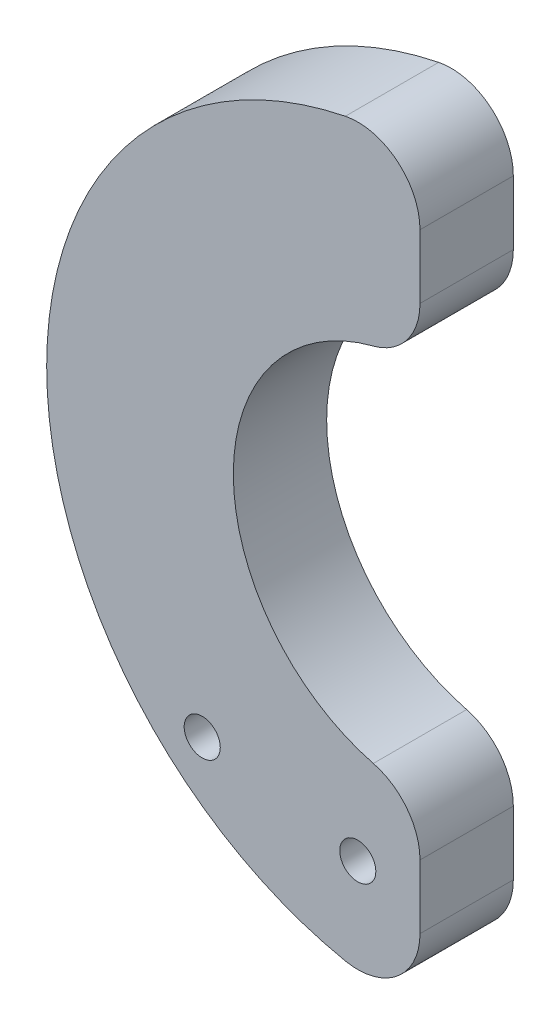
ISO-10303-21;
HEADER;
FILE_DESCRIPTION(('STEP AP214'),'2;1');
FILE_NAME('part.step','',(''),(''),'','','');
FILE_SCHEMA(('AUTOMOTIVE_DESIGN { 1 0 10303 214 1 1 1 1 }'));
ENDSEC;
DATA;
#1=APPLICATION_CONTEXT('core data for automotive mechanical design processes');
#2=APPLICATION_PROTOCOL_DEFINITION('international standard','automotive_design',2000,#1);
#3=PRODUCT_CONTEXT('',#1,'mechanical');
#4=PRODUCT('Part','Part','',(#3));
#5=PRODUCT_RELATED_PRODUCT_CATEGORY('part','',(#4));
#6=PRODUCT_DEFINITION_FORMATION('','',#4);
#7=PRODUCT_DEFINITION_CONTEXT('part definition',#1,'design');
#8=PRODUCT_DEFINITION('design','',#6,#7);
#9=PRODUCT_DEFINITION_SHAPE('','',#8);
#10=(LENGTH_UNIT() NAMED_UNIT(*) SI_UNIT(.MILLI.,.METRE.));
#11=(NAMED_UNIT(*) PLANE_ANGLE_UNIT() SI_UNIT($,.RADIAN.));
#12=(NAMED_UNIT(*) SI_UNIT($,.STERADIAN.) SOLID_ANGLE_UNIT());
#13=UNCERTAINTY_MEASURE_WITH_UNIT(LENGTH_MEASURE(1.E-05),#10,'distance_accuracy_value','');
#14=(GEOMETRIC_REPRESENTATION_CONTEXT(3) GLOBAL_UNCERTAINTY_ASSIGNED_CONTEXT((#13)) GLOBAL_UNIT_ASSIGNED_CONTEXT((#10,
#11,#12)) REPRESENTATION_CONTEXT('',''));
#15=CARTESIAN_POINT('',(0.,0.,0.));
#16=DIRECTION('',(0.,0.,1.));
#17=DIRECTION('',(1.,0.,0.));
#18=AXIS2_PLACEMENT_3D('',#15,#16,#17);
#19=CARTESIAN_POINT('',(-3.175,12.2967221242086,4.7625));
#20=DIRECTION('',(0.,0.,-1.));
#21=DIRECTION('',(-1.,0.,0.));
#22=AXIS2_PLACEMENT_3D('',#19,#20,#21);
#23=CYLINDRICAL_SURFACE('',#22,3.175);
#24=CARTESIAN_POINT('',(-3.175,12.2967221242086,0.));
#25=DIRECTION('',(0.,0.,-1.));
#26=DIRECTION('',(-1.,0.,0.));
#27=AXIS2_PLACEMENT_3D('',#24,#25,#26);
#28=CIRCLE('',#27,3.175);
#29=CARTESIAN_POINT('',(0.,12.2967221242086,0.));
#30=VERTEX_POINT('',#29);
#31=CARTESIAN_POINT('',(-2.38125,9.22254159315641,0.));
#32=VERTEX_POINT('',#31);
#33=EDGE_CURVE('E132',#30,#32,#28,.T.);
#34=ORIENTED_EDGE('',*,*,#33,.F.);
#35=DIRECTION('',(0.,0.,-1.));
#36=VECTOR('',#35,1.);
#37=CARTESIAN_POINT('',(0.,12.2967221242086,4.7625));
#38=LINE('',#37,#36);
#39=CARTESIAN_POINT('',(0.,12.2967221242086,4.7625));
#40=VERTEX_POINT('',#39);
#41=EDGE_CURVE('E11',#40,#30,#38,.T.);
#42=ORIENTED_EDGE('',*,*,#41,.F.);
#43=CARTESIAN_POINT('',(-3.175,12.2967221242086,4.7625));
#44=DIRECTION('',(0.,0.,-1.));
#45=DIRECTION('',(-1.,0.,0.));
#46=AXIS2_PLACEMENT_3D('',#43,#44,#45);
#47=CIRCLE('',#46,3.175);
#48=CARTESIAN_POINT('',(-2.38125,9.22254159315641,4.7625));
#49=VERTEX_POINT('',#48);
#50=EDGE_CURVE('E153',#40,#49,#47,.T.);
#51=ORIENTED_EDGE('',*,*,#50,.T.);
#52=DIRECTION('',(0.,0.,-1.));
#53=VECTOR('',#52,1.);
#54=CARTESIAN_POINT('',(-2.38125,9.22254159315641,4.7625));
#55=LINE('',#54,#53);
#56=EDGE_CURVE('E38',#49,#32,#55,.T.);
#57=ORIENTED_EDGE('',*,*,#56,.T.);
#58=EDGE_LOOP('',(#34,#42,#51,#57));
#59=FACE_BOUND('',#58,.T.);
#60=ADVANCED_FACE('F35',(#59),#23,.T.);
#61=CARTESIAN_POINT('',(0.,15.5542598666732,4.7625));
#62=DIRECTION('',(1.,0.,0.));
#63=DIRECTION('',(0.,1.,0.));
#64=AXIS2_PLACEMENT_3D('',#61,#62,#63);
#65=PLANE('',#64);
#66=DIRECTION('',(0.,-1.,0.));
#67=VECTOR('',#66,1.);
#68=CARTESIAN_POINT('',(0.,15.5542598666732,0.));
#69=LINE('',#68,#67);
#70=CARTESIAN_POINT('',(0.,15.5542598666732,0.));
#71=VERTEX_POINT('',#70);
#72=EDGE_CURVE('E151',#71,#30,#69,.T.);
#73=ORIENTED_EDGE('',*,*,#72,.F.);
#74=DIRECTION('',(0.,0.,-1.));
#75=VECTOR('',#74,1.);
#76=CARTESIAN_POINT('',(0.,15.5542598666732,4.7625));
#77=LINE('',#76,#75);
#78=CARTESIAN_POINT('',(0.,15.5542598666732,4.7625));
#79=VERTEX_POINT('',#78);
#80=EDGE_CURVE('E44',#79,#71,#77,.T.);
#81=ORIENTED_EDGE('',*,*,#80,.F.);
#82=DIRECTION('',(0.,-1.,0.));
#83=VECTOR('',#82,1.);
#84=CARTESIAN_POINT('',(0.,15.5542598666732,4.7625));
#85=LINE('',#84,#83);
#86=EDGE_CURVE('E114',#79,#40,#85,.T.);
#87=ORIENTED_EDGE('',*,*,#86,.T.);
#88=ORIENTED_EDGE('',*,*,#41,.T.);
#89=EDGE_LOOP('',(#73,#81,#87,#88));
#90=FACE_BOUND('',#89,.T.);
#91=ADVANCED_FACE('F166',(#90),#65,.T.);
#92=CARTESIAN_POINT('',(-3.175,15.5542598666732,4.7625));
#93=DIRECTION('',(0.,0.,-1.));
#94=DIRECTION('',(-1.,0.,0.));
#95=AXIS2_PLACEMENT_3D('',#92,#93,#94);
#96=CYLINDRICAL_SURFACE('',#95,3.175);
#97=CARTESIAN_POINT('',(-3.175,15.5542598666732,0.));
#98=DIRECTION('',(0.,0.,1.));
#99=DIRECTION('',(1.,0.,0.));
#100=AXIS2_PLACEMENT_3D('',#97,#98,#99);
#101=CIRCLE('',#100,3.175);
#102=CARTESIAN_POINT('',(-3.81,18.6651118400078,0.));
#103=VERTEX_POINT('',#102);
#104=EDGE_CURVE('E118',#71,#103,#101,.T.);
#105=ORIENTED_EDGE('',*,*,#104,.T.);
#106=DIRECTION('',(0.,0.,-1.));
#107=VECTOR('',#106,1.);
#108=CARTESIAN_POINT('',(-3.81,18.6651118400078,4.7625));
#109=LINE('',#108,#107);
#110=CARTESIAN_POINT('',(-3.81,18.6651118400078,4.7625));
#111=VERTEX_POINT('',#110);
#112=EDGE_CURVE('E116',#111,#103,#109,.T.);
#113=ORIENTED_EDGE('',*,*,#112,.F.);
#114=CARTESIAN_POINT('',(-3.175,15.5542598666732,4.7625));
#115=DIRECTION('',(0.,0.,1.));
#116=DIRECTION('',(1.,0.,0.));
#117=AXIS2_PLACEMENT_3D('',#114,#115,#116);
#118=CIRCLE('',#117,3.175);
#119=EDGE_CURVE('E107',#79,#111,#118,.T.);
#120=ORIENTED_EDGE('',*,*,#119,.F.);
#121=ORIENTED_EDGE('',*,*,#80,.T.);
#122=EDGE_LOOP('',(#105,#113,#120,#121));
#123=FACE_BOUND('',#122,.T.);
#124=ADVANCED_FACE('F117',(#123),#96,.T.);
#125=CARTESIAN_POINT('',(0.,0.,4.7625));
#126=DIRECTION('',(0.,0.,-1.));
#127=DIRECTION('',(-1.,0.,0.));
#128=AXIS2_PLACEMENT_3D('',#125,#126,#127);
#129=CYLINDRICAL_SURFACE('',#128,19.05);
#130=CARTESIAN_POINT('',(0.,0.,0.));
#131=DIRECTION('',(0.,0.,-1.));
#132=DIRECTION('',(-1.,0.,0.));
#133=AXIS2_PLACEMENT_3D('',#130,#131,#132);
#134=CIRCLE('',#133,19.05);
#135=CARTESIAN_POINT('',(-3.81,-18.6651118400078,0.));
#136=VERTEX_POINT('',#135);
#137=EDGE_CURVE('E148',#136,#103,#134,.T.);
#138=ORIENTED_EDGE('',*,*,#137,.F.);
#139=DIRECTION('',(0.,0.,-1.));
#140=VECTOR('',#139,1.);
#141=CARTESIAN_POINT('',(-3.81,-18.6651118400078,4.7625));
#142=LINE('',#141,#140);
#143=CARTESIAN_POINT('',(-3.81,-18.6651118400078,4.7625));
#144=VERTEX_POINT('',#143);
#145=EDGE_CURVE('E122',#144,#136,#142,.T.);
#146=ORIENTED_EDGE('',*,*,#145,.F.);
#147=CARTESIAN_POINT('',(0.,0.,4.7625));
#148=DIRECTION('',(0.,0.,-1.));
#149=DIRECTION('',(-1.,0.,0.));
#150=AXIS2_PLACEMENT_3D('',#147,#148,#149);
#151=CIRCLE('',#150,19.05);
#152=EDGE_CURVE('E112',#144,#111,#151,.T.);
#153=ORIENTED_EDGE('',*,*,#152,.T.);
#154=ORIENTED_EDGE('',*,*,#112,.T.);
#155=EDGE_LOOP('',(#138,#146,#153,#154));
#156=FACE_BOUND('',#155,.T.);
#157=ADVANCED_FACE('F124',(#156),#129,.T.);
#158=CARTESIAN_POINT('',(-3.175,-15.5542598666732,4.7625));
#159=DIRECTION('',(0.,0.,-1.));
#160=DIRECTION('',(-1.,0.,0.));
#161=AXIS2_PLACEMENT_3D('',#158,#159,#160);
#162=CYLINDRICAL_SURFACE('',#161,3.175);
#163=CARTESIAN_POINT('',(-3.175,-15.5542598666732,0.));
#164=DIRECTION('',(0.,0.,-1.));
#165=DIRECTION('',(-1.,0.,0.));
#166=AXIS2_PLACEMENT_3D('',#163,#164,#165);
#167=CIRCLE('',#166,3.175);
#168=CARTESIAN_POINT('',(0.,-15.5542598666732,0.));
#169=VERTEX_POINT('',#168);
#170=EDGE_CURVE('E145',#169,#136,#167,.T.);
#171=ORIENTED_EDGE('',*,*,#170,.F.);
#172=DIRECTION('',(0.,0.,-1.));
#173=VECTOR('',#172,1.);
#174=CARTESIAN_POINT('',(0.,-15.5542598666732,4.7625));
#175=LINE('',#174,#173);
#176=CARTESIAN_POINT('',(0.,-15.5542598666732,4.7625));
#177=VERTEX_POINT('',#176);
#178=EDGE_CURVE('E157',#177,#169,#175,.T.);
#179=ORIENTED_EDGE('',*,*,#178,.F.);
#180=CARTESIAN_POINT('',(-3.175,-15.5542598666732,4.7625));
#181=DIRECTION('',(0.,0.,-1.));
#182=DIRECTION('',(-1.,0.,0.));
#183=AXIS2_PLACEMENT_3D('',#180,#181,#182);
#184=CIRCLE('',#183,3.175);
#185=EDGE_CURVE('E125',#177,#144,#184,.T.);
#186=ORIENTED_EDGE('',*,*,#185,.T.);
#187=ORIENTED_EDGE('',*,*,#145,.T.);
#188=EDGE_LOOP('',(#171,#179,#186,#187));
#189=FACE_BOUND('',#188,.T.);
#190=ADVANCED_FACE('F179',(#189),#162,.T.);
#191=CARTESIAN_POINT('',(0.,-12.2967221242085,4.7625));
#192=DIRECTION('',(1.,0.,0.));
#193=DIRECTION('',(0.,1.,0.));
#194=AXIS2_PLACEMENT_3D('',#191,#192,#193);
#195=PLANE('',#194);
#196=DIRECTION('',(0.,-1.,0.));
#197=VECTOR('',#196,1.);
#198=CARTESIAN_POINT('',(0.,-12.2967221242085,0.));
#199=LINE('',#198,#197);
#200=CARTESIAN_POINT('',(0.,-12.2967221242085,0.));
#201=VERTEX_POINT('',#200);
#202=EDGE_CURVE('E142',#201,#169,#199,.T.);
#203=ORIENTED_EDGE('',*,*,#202,.F.);
#204=DIRECTION('',(0.,0.,-1.));
#205=VECTOR('',#204,1.);
#206=CARTESIAN_POINT('',(0.,-12.2967221242085,4.7625));
#207=LINE('',#206,#205);
#208=CARTESIAN_POINT('',(0.,-12.2967221242085,4.7625));
#209=VERTEX_POINT('',#208);
#210=EDGE_CURVE('E159',#209,#201,#207,.T.);
#211=ORIENTED_EDGE('',*,*,#210,.F.);
#212=DIRECTION('',(0.,-1.,0.));
#213=VECTOR('',#212,1.);
#214=CARTESIAN_POINT('',(0.,-12.2967221242085,4.7625));
#215=LINE('',#214,#213);
#216=EDGE_CURVE('E127',#209,#177,#215,.T.);
#217=ORIENTED_EDGE('',*,*,#216,.T.);
#218=ORIENTED_EDGE('',*,*,#178,.T.);
#219=EDGE_LOOP('',(#203,#211,#217,#218));
#220=FACE_BOUND('',#219,.T.);
#221=ADVANCED_FACE('F182',(#220),#195,.T.);
#222=CARTESIAN_POINT('',(-3.175,-12.2967221242085,4.7625));
#223=DIRECTION('',(0.,0.,-1.));
#224=DIRECTION('',(-1.,0.,0.));
#225=AXIS2_PLACEMENT_3D('',#222,#223,#224);
#226=CYLINDRICAL_SURFACE('',#225,3.175);
#227=CARTESIAN_POINT('',(-3.175,-12.2967221242085,0.));
#228=DIRECTION('',(0.,0.,1.));
#229=DIRECTION('',(1.,0.,0.));
#230=AXIS2_PLACEMENT_3D('',#227,#228,#229);
#231=CIRCLE('',#230,3.175);
#232=CARTESIAN_POINT('',(-2.38125,-9.22254159315641,0.));
#233=VERTEX_POINT('',#232);
#234=EDGE_CURVE('E139',#201,#233,#231,.T.);
#235=ORIENTED_EDGE('',*,*,#234,.T.);
#236=DIRECTION('',(0.,0.,-1.));
#237=VECTOR('',#236,1.);
#238=CARTESIAN_POINT('',(-2.38125,-9.22254159315641,4.7625));
#239=LINE('',#238,#237);
#240=CARTESIAN_POINT('',(-2.38125,-9.22254159315641,4.7625));
#241=VERTEX_POINT('',#240);
#242=EDGE_CURVE('E160',#241,#233,#239,.T.);
#243=ORIENTED_EDGE('',*,*,#242,.F.);
#244=CARTESIAN_POINT('',(-3.175,-12.2967221242085,4.7625));
#245=DIRECTION('',(0.,0.,1.));
#246=DIRECTION('',(1.,0.,0.));
#247=AXIS2_PLACEMENT_3D('',#244,#245,#246);
#248=CIRCLE('',#247,3.175);
#249=EDGE_CURVE('E228',#209,#241,#248,.T.);
#250=ORIENTED_EDGE('',*,*,#249,.F.);
#251=ORIENTED_EDGE('',*,*,#210,.T.);
#252=EDGE_LOOP('',(#235,#243,#250,#251));
#253=FACE_BOUND('',#252,.T.);
#254=ADVANCED_FACE('F186',(#253),#226,.T.);
#255=CARTESIAN_POINT('',(0.,0.,4.7625));
#256=DIRECTION('',(0.,0.,-1.));
#257=DIRECTION('',(-1.,0.,0.));
#258=AXIS2_PLACEMENT_3D('',#255,#256,#257);
#259=CYLINDRICAL_SURFACE('',#258,9.525);
#260=CARTESIAN_POINT('',(0.,0.,0.));
#261=DIRECTION('',(0.,0.,1.));
#262=DIRECTION('',(1.,0.,0.));
#263=AXIS2_PLACEMENT_3D('',#260,#261,#262);
#264=CIRCLE('',#263,9.525);
#265=EDGE_CURVE('E135',#32,#233,#264,.T.);
#266=ORIENTED_EDGE('',*,*,#265,.F.);
#267=ORIENTED_EDGE('',*,*,#56,.F.);
#268=CARTESIAN_POINT('',(0.,0.,4.7625));
#269=DIRECTION('',(0.,0.,1.));
#270=DIRECTION('',(1.,0.,0.));
#271=AXIS2_PLACEMENT_3D('',#268,#269,#270);
#272=CIRCLE('',#271,9.525);
#273=EDGE_CURVE('E226',#49,#241,#272,.T.);
#274=ORIENTED_EDGE('',*,*,#273,.T.);
#275=ORIENTED_EDGE('',*,*,#242,.T.);
#276=EDGE_LOOP('',(#266,#267,#274,#275));
#277=FACE_BOUND('',#276,.T.);
#278=ADVANCED_FACE('F162',(#277),#259,.F.);
#279=CARTESIAN_POINT('',(-3.175,12.2967221242086,4.7625));
#280=DIRECTION('',(0.,0.,-1.));
#281=DIRECTION('',(-1.,0.,0.));
#282=AXIS2_PLACEMENT_3D('',#279,#280,#281);
#283=PLANE('',#282);
#284=CARTESIAN_POINT('',(-3.175,-13.930255964985,4.7625));
#285=DIRECTION('',(0.,0.,1.));
#286=DIRECTION('',(1.,0.,0.));
#287=AXIS2_PLACEMENT_3D('',#284,#285,#286);
#288=CIRCLE('',#287,0.92075);
#289=CARTESIAN_POINT('',(-2.25425,-13.930255964985,4.7625));
#290=VERTEX_POINT('',#289);
#291=EDGE_CURVE('E215',#290,#290,#288,.T.);
#292=ORIENTED_EDGE('',*,*,#291,.F.);
#293=EDGE_LOOP('',(#292));
#294=FACE_BOUND('',#293,.T.);
#295=CARTESIAN_POINT('',(-11.1125,-12.4241526999832,4.7625));
#296=DIRECTION('',(0.,0.,1.));
#297=DIRECTION('',(1.,0.,0.));
#298=AXIS2_PLACEMENT_3D('',#295,#296,#297);
#299=CIRCLE('',#298,0.92075);
#300=CARTESIAN_POINT('',(-10.19175,-12.4241526999832,4.7625));
#301=VERTEX_POINT('',#300);
#302=EDGE_CURVE('E216',#301,#301,#299,.T.);
#303=ORIENTED_EDGE('',*,*,#302,.F.);
#304=EDGE_LOOP('',(#303));
#305=FACE_BOUND('',#304,.T.);
#306=ORIENTED_EDGE('',*,*,#50,.F.);
#307=ORIENTED_EDGE('',*,*,#86,.F.);
#308=ORIENTED_EDGE('',*,*,#119,.T.);
#309=ORIENTED_EDGE('',*,*,#152,.F.);
#310=ORIENTED_EDGE('',*,*,#185,.F.);
#311=ORIENTED_EDGE('',*,*,#216,.F.);
#312=ORIENTED_EDGE('',*,*,#249,.T.);
#313=ORIENTED_EDGE('',*,*,#273,.F.);
#314=EDGE_LOOP('',(#306,#307,#308,#309,#310,#311,#312,#313));
#315=FACE_BOUND('',#314,.T.);
#316=ADVANCED_FACE('F109',(#294,#305,#315),#283,.F.);
#317=CARTESIAN_POINT('',(-3.175,12.2967221242086,0.));
#318=DIRECTION('',(0.,0.,-1.));
#319=DIRECTION('',(-1.,0.,0.));
#320=AXIS2_PLACEMENT_3D('',#317,#318,#319);
#321=PLANE('',#320);
#322=CARTESIAN_POINT('',(-3.175,-13.930255964985,0.));
#323=DIRECTION('',(0.,0.,1.));
#324=DIRECTION('',(1.,0.,0.));
#325=AXIS2_PLACEMENT_3D('',#322,#323,#324);
#326=CIRCLE('',#325,0.92075);
#327=CARTESIAN_POINT('',(-2.25425,-13.930255964985,0.));
#328=VERTEX_POINT('',#327);
#329=EDGE_CURVE('E136',#328,#328,#326,.T.);
#330=ORIENTED_EDGE('',*,*,#329,.T.);
#331=EDGE_LOOP('',(#330));
#332=FACE_BOUND('',#331,.T.);
#333=CARTESIAN_POINT('',(-11.1125,-12.4241526999832,0.));
#334=DIRECTION('',(0.,0.,1.));
#335=DIRECTION('',(1.,0.,0.));
#336=AXIS2_PLACEMENT_3D('',#333,#334,#335);
#337=CIRCLE('',#336,0.92075);
#338=CARTESIAN_POINT('',(-10.19175,-12.4241526999832,0.));
#339=VERTEX_POINT('',#338);
#340=EDGE_CURVE('E220',#339,#339,#337,.T.);
#341=ORIENTED_EDGE('',*,*,#340,.T.);
#342=EDGE_LOOP('',(#341));
#343=FACE_BOUND('',#342,.T.);
#344=ORIENTED_EDGE('',*,*,#33,.T.);
#345=ORIENTED_EDGE('',*,*,#265,.T.);
#346=ORIENTED_EDGE('',*,*,#234,.F.);
#347=ORIENTED_EDGE('',*,*,#202,.T.);
#348=ORIENTED_EDGE('',*,*,#170,.T.);
#349=ORIENTED_EDGE('',*,*,#137,.T.);
#350=ORIENTED_EDGE('',*,*,#104,.F.);
#351=ORIENTED_EDGE('',*,*,#72,.T.);
#352=EDGE_LOOP('',(#344,#345,#346,#347,#348,#349,#350,#351));
#353=FACE_BOUND('',#352,.T.);
#354=ADVANCED_FACE('F165',(#332,#343,#353),#321,.T.);
#355=CARTESIAN_POINT('',(-11.1125,-12.4241526999832,0.));
#356=DIRECTION('',(0.,0.,1.));
#357=DIRECTION('',(1.,0.,0.));
#358=AXIS2_PLACEMENT_3D('',#355,#356,#357);
#359=CYLINDRICAL_SURFACE('',#358,0.92075);
#360=CARTESIAN_POINT('',(-10.19175,-12.4241526999832,0.));
#361=CARTESIAN_POINT('',(-10.19175,-12.4241526999832,0.049609375));
#362=CARTESIAN_POINT('',(-10.19175,-12.4241526999832,0.09921875));
#363=CARTESIAN_POINT('',(-10.19175,-12.4241526999832,0.1984375));
#364=CARTESIAN_POINT('',(-10.19175,-12.4241526999832,0.248046875));
#365=CARTESIAN_POINT('',(-10.19175,-12.4241526999832,0.347265625));
#366=CARTESIAN_POINT('',(-10.19175,-12.4241526999832,0.396875));
#367=CARTESIAN_POINT('',(-10.19175,-12.4241526999832,0.49609375));
#368=CARTESIAN_POINT('',(-10.19175,-12.4241526999832,0.545703125));
#369=CARTESIAN_POINT('',(-10.19175,-12.4241526999832,0.644921875));
#370=CARTESIAN_POINT('',(-10.19175,-12.4241526999832,0.69453125));
#371=CARTESIAN_POINT('',(-10.19175,-12.4241526999832,0.79375));
#372=CARTESIAN_POINT('',(-10.19175,-12.4241526999832,0.843359375));
#373=CARTESIAN_POINT('',(-10.19175,-12.4241526999832,0.942578125));
#374=CARTESIAN_POINT('',(-10.19175,-12.4241526999832,0.9921875));
#375=CARTESIAN_POINT('',(-10.19175,-12.4241526999832,1.09140625));
#376=CARTESIAN_POINT('',(-10.19175,-12.4241526999832,1.141015625));
#377=CARTESIAN_POINT('',(-10.19175,-12.4241526999832,1.240234375));
#378=CARTESIAN_POINT('',(-10.19175,-12.4241526999832,1.28984375));
#379=CARTESIAN_POINT('',(-10.19175,-12.4241526999832,1.3890625));
#380=CARTESIAN_POINT('',(-10.19175,-12.4241526999832,1.438671875));
#381=CARTESIAN_POINT('',(-10.19175,-12.4241526999832,1.537890625));
#382=CARTESIAN_POINT('',(-10.19175,-12.4241526999832,1.5875));
#383=CARTESIAN_POINT('',(-10.19175,-12.4241526999832,1.68671875));
#384=CARTESIAN_POINT('',(-10.19175,-12.4241526999832,1.736328125));
#385=CARTESIAN_POINT('',(-10.19175,-12.4241526999832,1.835546875));
#386=CARTESIAN_POINT('',(-10.19175,-12.4241526999832,1.88515625));
#387=CARTESIAN_POINT('',(-10.19175,-12.4241526999832,1.984375));
#388=CARTESIAN_POINT('',(-10.19175,-12.4241526999832,2.033984375));
#389=CARTESIAN_POINT('',(-10.19175,-12.4241526999832,2.133203125));
#390=CARTESIAN_POINT('',(-10.19175,-12.4241526999832,2.1828125));
#391=CARTESIAN_POINT('',(-10.19175,-12.4241526999832,2.28203125));
#392=CARTESIAN_POINT('',(-10.19175,-12.4241526999832,2.331640625));
#393=CARTESIAN_POINT('',(-10.19175,-12.4241526999832,2.430859375));
#394=CARTESIAN_POINT('',(-10.19175,-12.4241526999832,2.48046875));
#395=CARTESIAN_POINT('',(-10.19175,-12.4241526999832,2.5796875));
#396=CARTESIAN_POINT('',(-10.19175,-12.4241526999832,2.629296875));
#397=CARTESIAN_POINT('',(-10.19175,-12.4241526999832,2.728515625));
#398=CARTESIAN_POINT('',(-10.19175,-12.4241526999832,2.778125));
#399=CARTESIAN_POINT('',(-10.19175,-12.4241526999832,2.87734375));
#400=CARTESIAN_POINT('',(-10.19175,-12.4241526999832,2.926953125));
#401=CARTESIAN_POINT('',(-10.19175,-12.4241526999832,3.026171875));
#402=CARTESIAN_POINT('',(-10.19175,-12.4241526999832,3.07578125));
#403=CARTESIAN_POINT('',(-10.19175,-12.4241526999832,3.175));
#404=CARTESIAN_POINT('',(-10.19175,-12.4241526999832,3.224609375));
#405=CARTESIAN_POINT('',(-10.19175,-12.4241526999832,3.323828125));
#406=CARTESIAN_POINT('',(-10.19175,-12.4241526999832,3.3734375));
#407=CARTESIAN_POINT('',(-10.19175,-12.4241526999832,3.47265625));
#408=CARTESIAN_POINT('',(-10.19175,-12.4241526999832,3.522265625));
#409=CARTESIAN_POINT('',(-10.19175,-12.4241526999832,3.621484375));
#410=CARTESIAN_POINT('',(-10.19175,-12.4241526999832,3.67109375));
#411=CARTESIAN_POINT('',(-10.19175,-12.4241526999832,3.7703125));
#412=CARTESIAN_POINT('',(-10.19175,-12.4241526999832,3.819921875));
#413=CARTESIAN_POINT('',(-10.19175,-12.4241526999832,3.919140625));
#414=CARTESIAN_POINT('',(-10.19175,-12.4241526999832,3.96875));
#415=CARTESIAN_POINT('',(-10.19175,-12.4241526999832,4.06796875));
#416=CARTESIAN_POINT('',(-10.19175,-12.4241526999832,4.117578125));
#417=CARTESIAN_POINT('',(-10.19175,-12.4241526999832,4.216796875));
#418=CARTESIAN_POINT('',(-10.19175,-12.4241526999832,4.26640625));
#419=CARTESIAN_POINT('',(-10.19175,-12.4241526999832,4.365625));
#420=CARTESIAN_POINT('',(-10.19175,-12.4241526999832,4.415234375));
#421=CARTESIAN_POINT('',(-10.19175,-12.4241526999832,4.514453125));
#422=CARTESIAN_POINT('',(-10.19175,-12.4241526999832,4.5640625));
#423=CARTESIAN_POINT('',(-10.19175,-12.4241526999832,4.66328125));
#424=CARTESIAN_POINT('',(-10.19175,-12.4241526999832,4.712890625));
#425=CARTESIAN_POINT('',(-10.19175,-12.4241526999832,4.7625));
#426=B_SPLINE_CURVE_WITH_KNOTS('',3,(#360,#361,#362,#363,#364,#365,#366,#367,#368,#369,#370,
#371,#372,#373,#374,#375,#376,#377,#378,#379,#380,#381,#382,#383,#384,#385,#386,#387,#388,#389,
#390,#391,#392,#393,#394,#395,#396,#397,#398,#399,#400,#401,#402,#403,#404,#405,#406,#407,#408,
#409,#410,#411,#412,#413,#414,#415,#416,#417,#418,#419,#420,#421,#422,#423,#424,#425),
.UNSPECIFIED.,.F.,.F.,(4,2,2,2,2,2,2,2,2,2,2,2,2,2,2,2,2,2,2,2,2,2,2,2,2,2,2,2,2,2,2,2,4),(0.,
0.148828125,0.29765625,0.446484375,0.5953125,0.744140625,0.89296875,1.041796875,1.190625,
1.339453125,1.48828125,1.637109375,1.7859375,1.934765625,2.08359375,2.232421875,2.38125,
2.530078125,2.67890625,2.827734375,2.9765625,3.125390625,3.27421875,3.423046875,3.571875,
3.720703125,3.86953125,4.018359375,4.1671875,4.316015625,4.46484375,4.613671875,4.7625),.UNSPECIFIED.);
#427=EDGE_CURVE('BSEAM198',#339,#301,#426,.T.);
#428=ORIENTED_EDGE('',*,*,#340,.F.);
#429=ORIENTED_EDGE('',*,*,#302,.T.);
#430=ORIENTED_EDGE('',*,*,#427,.T.);
#431=ORIENTED_EDGE('',*,*,#427,.F.);
#432=EDGE_LOOP('',(#428,#430,#429,#431));
#433=FACE_BOUND('',#432,.T.);
#434=ADVANCED_FACE('F198',(#433),#359,.F.);
#435=CARTESIAN_POINT('',(-3.175,-13.930255964985,0.));
#436=DIRECTION('',(0.,0.,1.));
#437=DIRECTION('',(1.,0.,0.));
#438=AXIS2_PLACEMENT_3D('',#435,#436,#437);
#439=CYLINDRICAL_SURFACE('',#438,0.92075);
#440=CARTESIAN_POINT('',(-2.25425,-13.930255964985,0.));
#441=CARTESIAN_POINT('',(-2.25425,-13.930255964985,0.049609375));
#442=CARTESIAN_POINT('',(-2.25425,-13.930255964985,0.09921875));
#443=CARTESIAN_POINT('',(-2.25425,-13.930255964985,0.1984375));
#444=CARTESIAN_POINT('',(-2.25425,-13.930255964985,0.248046875));
#445=CARTESIAN_POINT('',(-2.25425,-13.930255964985,0.347265625));
#446=CARTESIAN_POINT('',(-2.25425,-13.930255964985,0.396875));
#447=CARTESIAN_POINT('',(-2.25425,-13.930255964985,0.49609375));
#448=CARTESIAN_POINT('',(-2.25425,-13.930255964985,0.545703125));
#449=CARTESIAN_POINT('',(-2.25425,-13.930255964985,0.644921875));
#450=CARTESIAN_POINT('',(-2.25425,-13.930255964985,0.69453125));
#451=CARTESIAN_POINT('',(-2.25425,-13.930255964985,0.79375));
#452=CARTESIAN_POINT('',(-2.25425,-13.930255964985,0.843359375));
#453=CARTESIAN_POINT('',(-2.25425,-13.930255964985,0.942578125));
#454=CARTESIAN_POINT('',(-2.25425,-13.930255964985,0.9921875));
#455=CARTESIAN_POINT('',(-2.25425,-13.930255964985,1.09140625));
#456=CARTESIAN_POINT('',(-2.25425,-13.930255964985,1.141015625));
#457=CARTESIAN_POINT('',(-2.25425,-13.930255964985,1.240234375));
#458=CARTESIAN_POINT('',(-2.25425,-13.930255964985,1.28984375));
#459=CARTESIAN_POINT('',(-2.25425,-13.930255964985,1.3890625));
#460=CARTESIAN_POINT('',(-2.25425,-13.930255964985,1.438671875));
#461=CARTESIAN_POINT('',(-2.25425,-13.930255964985,1.537890625));
#462=CARTESIAN_POINT('',(-2.25425,-13.930255964985,1.5875));
#463=CARTESIAN_POINT('',(-2.25425,-13.930255964985,1.68671875));
#464=CARTESIAN_POINT('',(-2.25425,-13.930255964985,1.736328125));
#465=CARTESIAN_POINT('',(-2.25425,-13.930255964985,1.835546875));
#466=CARTESIAN_POINT('',(-2.25425,-13.930255964985,1.88515625));
#467=CARTESIAN_POINT('',(-2.25425,-13.930255964985,1.984375));
#468=CARTESIAN_POINT('',(-2.25425,-13.930255964985,2.033984375));
#469=CARTESIAN_POINT('',(-2.25425,-13.930255964985,2.133203125));
#470=CARTESIAN_POINT('',(-2.25425,-13.930255964985,2.1828125));
#471=CARTESIAN_POINT('',(-2.25425,-13.930255964985,2.28203125));
#472=CARTESIAN_POINT('',(-2.25425,-13.930255964985,2.331640625));
#473=CARTESIAN_POINT('',(-2.25425,-13.930255964985,2.430859375));
#474=CARTESIAN_POINT('',(-2.25425,-13.930255964985,2.48046875));
#475=CARTESIAN_POINT('',(-2.25425,-13.930255964985,2.5796875));
#476=CARTESIAN_POINT('',(-2.25425,-13.930255964985,2.629296875));
#477=CARTESIAN_POINT('',(-2.25425,-13.930255964985,2.728515625));
#478=CARTESIAN_POINT('',(-2.25425,-13.930255964985,2.778125));
#479=CARTESIAN_POINT('',(-2.25425,-13.930255964985,2.87734375));
#480=CARTESIAN_POINT('',(-2.25425,-13.930255964985,2.926953125));
#481=CARTESIAN_POINT('',(-2.25425,-13.930255964985,3.026171875));
#482=CARTESIAN_POINT('',(-2.25425,-13.930255964985,3.07578125));
#483=CARTESIAN_POINT('',(-2.25425,-13.930255964985,3.175));
#484=CARTESIAN_POINT('',(-2.25425,-13.930255964985,3.224609375));
#485=CARTESIAN_POINT('',(-2.25425,-13.930255964985,3.323828125));
#486=CARTESIAN_POINT('',(-2.25425,-13.930255964985,3.3734375));
#487=CARTESIAN_POINT('',(-2.25425,-13.930255964985,3.47265625));
#488=CARTESIAN_POINT('',(-2.25425,-13.930255964985,3.522265625));
#489=CARTESIAN_POINT('',(-2.25425,-13.930255964985,3.621484375));
#490=CARTESIAN_POINT('',(-2.25425,-13.930255964985,3.67109375));
#491=CARTESIAN_POINT('',(-2.25425,-13.930255964985,3.7703125));
#492=CARTESIAN_POINT('',(-2.25425,-13.930255964985,3.819921875));
#493=CARTESIAN_POINT('',(-2.25425,-13.930255964985,3.919140625));
#494=CARTESIAN_POINT('',(-2.25425,-13.930255964985,3.96875));
#495=CARTESIAN_POINT('',(-2.25425,-13.930255964985,4.06796875));
#496=CARTESIAN_POINT('',(-2.25425,-13.930255964985,4.117578125));
#497=CARTESIAN_POINT('',(-2.25425,-13.930255964985,4.216796875));
#498=CARTESIAN_POINT('',(-2.25425,-13.930255964985,4.26640625));
#499=CARTESIAN_POINT('',(-2.25425,-13.930255964985,4.365625));
#500=CARTESIAN_POINT('',(-2.25425,-13.930255964985,4.415234375));
#501=CARTESIAN_POINT('',(-2.25425,-13.930255964985,4.514453125));
#502=CARTESIAN_POINT('',(-2.25425,-13.930255964985,4.5640625));
#503=CARTESIAN_POINT('',(-2.25425,-13.930255964985,4.66328125));
#504=CARTESIAN_POINT('',(-2.25425,-13.930255964985,4.712890625));
#505=CARTESIAN_POINT('',(-2.25425,-13.930255964985,4.7625));
#506=B_SPLINE_CURVE_WITH_KNOTS('',3,(#440,#441,#442,#443,#444,#445,#446,#447,#448,#449,#450,
#451,#452,#453,#454,#455,#456,#457,#458,#459,#460,#461,#462,#463,#464,#465,#466,#467,#468,#469,
#470,#471,#472,#473,#474,#475,#476,#477,#478,#479,#480,#481,#482,#483,#484,#485,#486,#487,#488,
#489,#490,#491,#492,#493,#494,#495,#496,#497,#498,#499,#500,#501,#502,#503,#504,#505),
.UNSPECIFIED.,.F.,.F.,(4,2,2,2,2,2,2,2,2,2,2,2,2,2,2,2,2,2,2,2,2,2,2,2,2,2,2,2,2,2,2,2,4),(0.,
0.148828125,0.29765625,0.446484375,0.5953125,0.744140625,0.89296875,1.041796875,1.190625,
1.339453125,1.48828125,1.637109375,1.7859375,1.934765625,2.08359375,2.232421875,2.38125,
2.530078125,2.67890625,2.827734375,2.9765625,3.125390625,3.27421875,3.423046875,3.571875,
3.720703125,3.86953125,4.018359375,4.1671875,4.316015625,4.46484375,4.613671875,4.7625),.UNSPECIFIED.);
#507=EDGE_CURVE('BSEAM205',#328,#290,#506,.T.);
#508=ORIENTED_EDGE('',*,*,#329,.F.);
#509=ORIENTED_EDGE('',*,*,#291,.T.);
#510=ORIENTED_EDGE('',*,*,#507,.T.);
#511=ORIENTED_EDGE('',*,*,#507,.F.);
#512=EDGE_LOOP('',(#508,#510,#509,#511));
#513=FACE_BOUND('',#512,.T.);
#514=ADVANCED_FACE('F205',(#513),#439,.F.);
#515=CLOSED_SHELL('',(#60,#91,#124,#157,#190,#221,#254,#278,#316,#354,#434,#514));
#516=MANIFOLD_SOLID_BREP('B2',#515);
#517=ADVANCED_BREP_SHAPE_REPRESENTATION('',(#18,#516),#14);
#518=SHAPE_DEFINITION_REPRESENTATION(#9,#517);
ENDSEC;
END-ISO-10303-21;
